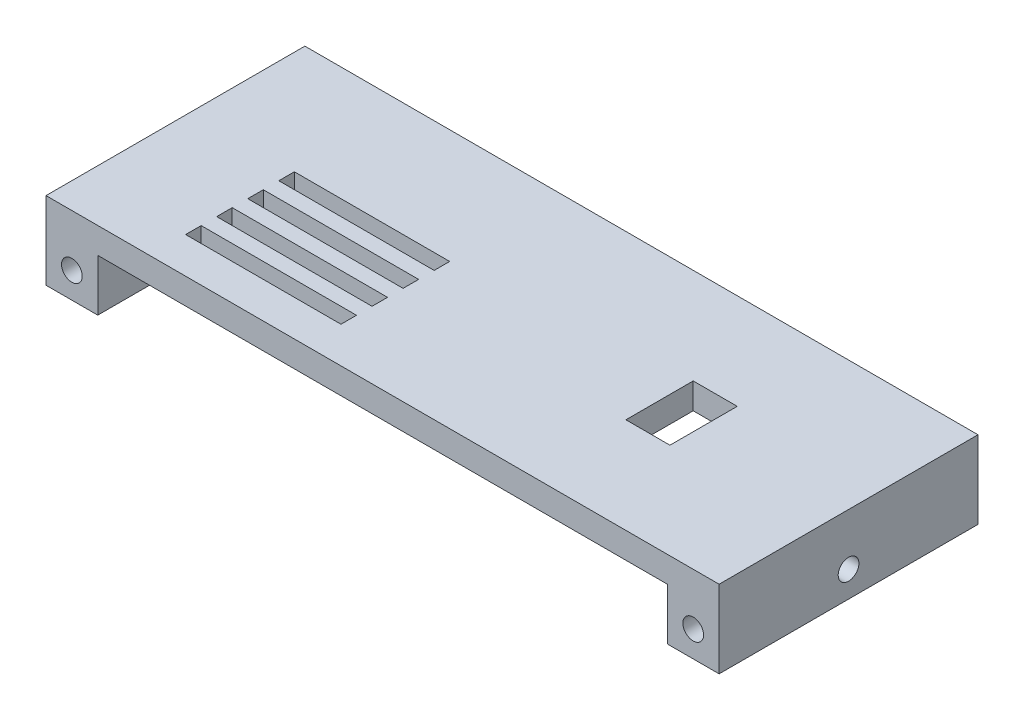
ISO-10303-21;
HEADER;
FILE_DESCRIPTION(('STEP AP214'),'2;1');
FILE_NAME('part.step','',(''),(''),'','','');
FILE_SCHEMA(('AUTOMOTIVE_DESIGN { 1 0 10303 214 1 1 1 1 }'));
ENDSEC;
DATA;
#1=APPLICATION_CONTEXT('core data for automotive mechanical design processes');
#2=APPLICATION_PROTOCOL_DEFINITION('international standard','automotive_design',2000,#1);
#3=PRODUCT_CONTEXT('',#1,'mechanical');
#4=PRODUCT('Part','Part','',(#3));
#5=PRODUCT_RELATED_PRODUCT_CATEGORY('part','',(#4));
#6=PRODUCT_DEFINITION_FORMATION('','',#4);
#7=PRODUCT_DEFINITION_CONTEXT('part definition',#1,'design');
#8=PRODUCT_DEFINITION('design','',#6,#7);
#9=PRODUCT_DEFINITION_SHAPE('','',#8);
#10=(LENGTH_UNIT() NAMED_UNIT(*) SI_UNIT(.MILLI.,.METRE.));
#11=(NAMED_UNIT(*) PLANE_ANGLE_UNIT() SI_UNIT($,.RADIAN.));
#12=(NAMED_UNIT(*) SI_UNIT($,.STERADIAN.) SOLID_ANGLE_UNIT());
#13=UNCERTAINTY_MEASURE_WITH_UNIT(LENGTH_MEASURE(1.E-05),#10,'distance_accuracy_value','');
#14=(GEOMETRIC_REPRESENTATION_CONTEXT(3) GLOBAL_UNCERTAINTY_ASSIGNED_CONTEXT((#13)) GLOBAL_UNIT_ASSIGNED_CONTEXT((#10,
#11,#12)) REPRESENTATION_CONTEXT('',''));
#15=CARTESIAN_POINT('',(0.,0.,0.));
#16=DIRECTION('',(0.,0.,1.));
#17=DIRECTION('',(1.,0.,0.));
#18=AXIS2_PLACEMENT_3D('',#15,#16,#17);
#19=CARTESIAN_POINT('',(0.,0.,0.));
#20=DIRECTION('',(0.,1.,0.));
#21=DIRECTION('',(0.,0.,1.));
#22=AXIS2_PLACEMENT_3D('',#19,#20,#21);
#23=PLANE('',#22);
#24=DIRECTION('',(-1.,0.,0.));
#25=VECTOR('',#24,1.);
#26=CARTESIAN_POINT('',(-130.,0.,-50.));
#27=LINE('',#26,#25);
#28=CARTESIAN_POINT('',(-120.,0.,-50.));
#29=VERTEX_POINT('',#28);
#30=CARTESIAN_POINT('',(-130.,0.,-50.));
#31=VERTEX_POINT('',#30);
#32=EDGE_CURVE('E480',#29,#31,#27,.T.);
#33=ORIENTED_EDGE('',*,*,#32,.F.);
#34=DIRECTION('',(0.,0.,1.));
#35=VECTOR('',#34,1.);
#36=CARTESIAN_POINT('',(-120.,0.,0.));
#37=LINE('',#36,#35);
#38=CARTESIAN_POINT('',(-120.,0.,0.));
#39=VERTEX_POINT('',#38);
#40=EDGE_CURVE('E503',#29,#39,#37,.T.);
#41=ORIENTED_EDGE('',*,*,#40,.T.);
#42=DIRECTION('',(1.,0.,0.));
#43=VECTOR('',#42,1.);
#44=CARTESIAN_POINT('',(-130.,0.,0.));
#45=LINE('',#44,#43);
#46=CARTESIAN_POINT('',(-130.,0.,0.));
#47=VERTEX_POINT('',#46);
#48=EDGE_CURVE('E473',#47,#39,#45,.T.);
#49=ORIENTED_EDGE('',*,*,#48,.F.);
#50=DIRECTION('',(0.,0.,1.));
#51=VECTOR('',#50,1.);
#52=CARTESIAN_POINT('',(-130.,0.,-50.));
#53=LINE('',#52,#51);
#54=EDGE_CURVE('E453',#31,#47,#53,.T.);
#55=ORIENTED_EDGE('',*,*,#54,.F.);
#56=EDGE_LOOP('',(#33,#41,#49,#55));
#57=FACE_BOUND('',#56,.T.);
#58=ADVANCED_FACE('F40',(#57),#23,.F.);
#59=CARTESIAN_POINT('',(-130.,15.,-50.));
#60=DIRECTION('',(1.,0.,0.));
#61=DIRECTION('',(0.,0.,-1.));
#62=AXIS2_PLACEMENT_3D('',#59,#60,#61);
#63=PLANE('',#62);
#64=CARTESIAN_POINT('',(-130.,5.,-25.));
#65=DIRECTION('',(-1.,0.,0.));
#66=DIRECTION('',(0.,0.,1.));
#67=AXIS2_PLACEMENT_3D('',#64,#65,#66);
#68=CIRCLE('',#67,2.);
#69=CARTESIAN_POINT('',(-130.,5.,-23.));
#70=VERTEX_POINT('',#69);
#71=EDGE_CURVE('E397',#70,#70,#68,.T.);
#72=ORIENTED_EDGE('',*,*,#71,.F.);
#73=EDGE_LOOP('',(#72));
#74=FACE_BOUND('',#73,.T.);
#75=ORIENTED_EDGE('',*,*,#54,.T.);
#76=DIRECTION('',(0.,-1.,0.));
#77=VECTOR('',#76,1.);
#78=CARTESIAN_POINT('',(-130.,15.,0.));
#79=LINE('',#78,#77);
#80=CARTESIAN_POINT('',(-130.,15.,0.));
#81=VERTEX_POINT('',#80);
#82=EDGE_CURVE('E495',#81,#47,#79,.T.);
#83=ORIENTED_EDGE('',*,*,#82,.F.);
#84=DIRECTION('',(0.,0.,1.));
#85=VECTOR('',#84,1.);
#86=CARTESIAN_POINT('',(-130.,15.,-50.));
#87=LINE('',#86,#85);
#88=CARTESIAN_POINT('',(-130.,15.,-50.));
#89=VERTEX_POINT('',#88);
#90=EDGE_CURVE('E454',#89,#81,#87,.T.);
#91=ORIENTED_EDGE('',*,*,#90,.F.);
#92=DIRECTION('',(0.,-1.,0.));
#93=VECTOR('',#92,1.);
#94=CARTESIAN_POINT('',(-130.,15.,-50.));
#95=LINE('',#94,#93);
#96=EDGE_CURVE('E468',#89,#31,#95,.T.);
#97=ORIENTED_EDGE('',*,*,#96,.T.);
#98=EDGE_LOOP('',(#75,#83,#91,#97));
#99=FACE_BOUND('',#98,.T.);
#100=ADVANCED_FACE('F42',(#74,#99),#63,.F.);
#101=CARTESIAN_POINT('',(-130.,15.,0.));
#102=DIRECTION('',(0.,0.,-1.));
#103=DIRECTION('',(-1.,0.,0.));
#104=AXIS2_PLACEMENT_3D('',#101,#102,#103);
#105=PLANE('',#104);
#106=CARTESIAN_POINT('',(-5.,5.,0.));
#107=DIRECTION('',(0.,0.,1.));
#108=DIRECTION('',(1.,0.,0.));
#109=AXIS2_PLACEMENT_3D('',#106,#107,#108);
#110=CIRCLE('',#109,2.);
#111=CARTESIAN_POINT('',(-3.,5.,0.));
#112=VERTEX_POINT('',#111);
#113=EDGE_CURVE('E398',#112,#112,#110,.T.);
#114=ORIENTED_EDGE('',*,*,#113,.F.);
#115=EDGE_LOOP('',(#114));
#116=FACE_BOUND('',#115,.T.);
#117=CARTESIAN_POINT('',(-125.,5.,0.));
#118=DIRECTION('',(0.,0.,1.));
#119=DIRECTION('',(1.,0.,0.));
#120=AXIS2_PLACEMENT_3D('',#117,#118,#119);
#121=CIRCLE('',#120,2.);
#122=CARTESIAN_POINT('',(-123.,5.,0.));
#123=VERTEX_POINT('',#122);
#124=EDGE_CURVE('E381',#123,#123,#121,.T.);
#125=ORIENTED_EDGE('',*,*,#124,.F.);
#126=EDGE_LOOP('',(#125));
#127=FACE_BOUND('',#126,.T.);
#128=ORIENTED_EDGE('',*,*,#48,.T.);
#129=DIRECTION('',(0.,1.,0.));
#130=VECTOR('',#129,1.);
#131=CARTESIAN_POINT('',(-120.,15.,0.));
#132=LINE('',#131,#130);
#133=CARTESIAN_POINT('',(-120.,10.,0.));
#134=VERTEX_POINT('',#133);
#135=EDGE_CURVE('E445',#39,#134,#132,.T.);
#136=ORIENTED_EDGE('',*,*,#135,.T.);
#137=DIRECTION('',(1.,0.,0.));
#138=VECTOR('',#137,1.);
#139=CARTESIAN_POINT('',(-130.,10.,0.));
#140=LINE('',#139,#138);
#141=CARTESIAN_POINT('',(-10.,10.,0.));
#142=VERTEX_POINT('',#141);
#143=EDGE_CURVE('E449',#134,#142,#140,.T.);
#144=ORIENTED_EDGE('',*,*,#143,.T.);
#145=DIRECTION('',(0.,-1.,0.));
#146=VECTOR('',#145,1.);
#147=CARTESIAN_POINT('',(-9.99999999999999,15.,0.));
#148=LINE('',#147,#146);
#149=CARTESIAN_POINT('',(-10.,0.,0.));
#150=VERTEX_POINT('',#149);
#151=EDGE_CURVE('E439',#142,#150,#148,.T.);
#152=ORIENTED_EDGE('',*,*,#151,.T.);
#153=CARTESIAN_POINT('',(0.,0.,0.));
#154=VERTEX_POINT('',#153);
#155=EDGE_CURVE('E472',#150,#154,#45,.T.);
#156=ORIENTED_EDGE('',*,*,#155,.T.);
#157=DIRECTION('',(0.,-1.,0.));
#158=VECTOR('',#157,1.);
#159=CARTESIAN_POINT('',(0.,15.,0.));
#160=LINE('',#159,#158);
#161=CARTESIAN_POINT('',(0.,15.,0.));
#162=VERTEX_POINT('',#161);
#163=EDGE_CURVE('E491',#162,#154,#160,.T.);
#164=ORIENTED_EDGE('',*,*,#163,.F.);
#165=DIRECTION('',(1.,0.,0.));
#166=VECTOR('',#165,1.);
#167=CARTESIAN_POINT('',(-130.,15.,0.));
#168=LINE('',#167,#166);
#169=EDGE_CURVE('E458',#81,#162,#168,.T.);
#170=ORIENTED_EDGE('',*,*,#169,.F.);
#171=ORIENTED_EDGE('',*,*,#82,.T.);
#172=EDGE_LOOP('',(#128,#136,#144,#152,#156,#164,#170,#171));
#173=FACE_BOUND('',#172,.T.);
#174=ADVANCED_FACE('F604',(#116,#127,#173),#105,.F.);
#175=CARTESIAN_POINT('',(0.,15.,-50.));
#176=DIRECTION('',(-1.,0.,0.));
#177=DIRECTION('',(0.,0.,1.));
#178=AXIS2_PLACEMENT_3D('',#175,#176,#177);
#179=PLANE('',#178);
#180=CARTESIAN_POINT('',(0.,5.,-25.));
#181=DIRECTION('',(1.,0.,0.));
#182=DIRECTION('',(0.,0.,-1.));
#183=AXIS2_PLACEMENT_3D('',#180,#181,#182);
#184=CIRCLE('',#183,2.);
#185=CARTESIAN_POINT('',(0.,5.,-27.));
#186=VERTEX_POINT('',#185);
#187=EDGE_CURVE('E413',#186,#186,#184,.T.);
#188=ORIENTED_EDGE('',*,*,#187,.F.);
#189=EDGE_LOOP('',(#188));
#190=FACE_BOUND('',#189,.T.);
#191=DIRECTION('',(0.,0.,-1.));
#192=VECTOR('',#191,1.);
#193=CARTESIAN_POINT('',(0.,0.,-50.));
#194=LINE('',#193,#192);
#195=CARTESIAN_POINT('',(0.,0.,-50.));
#196=VERTEX_POINT('',#195);
#197=EDGE_CURVE('E477',#154,#196,#194,.T.);
#198=ORIENTED_EDGE('',*,*,#197,.T.);
#199=DIRECTION('',(0.,-1.,0.));
#200=VECTOR('',#199,1.);
#201=CARTESIAN_POINT('',(0.,15.,-50.));
#202=LINE('',#201,#200);
#203=CARTESIAN_POINT('',(0.,15.,-50.));
#204=VERTEX_POINT('',#203);
#205=EDGE_CURVE('E487',#204,#196,#202,.T.);
#206=ORIENTED_EDGE('',*,*,#205,.F.);
#207=DIRECTION('',(0.,0.,-1.));
#208=VECTOR('',#207,1.);
#209=CARTESIAN_POINT('',(0.,15.,-50.));
#210=LINE('',#209,#208);
#211=EDGE_CURVE('E462',#162,#204,#210,.T.);
#212=ORIENTED_EDGE('',*,*,#211,.F.);
#213=ORIENTED_EDGE('',*,*,#163,.T.);
#214=EDGE_LOOP('',(#198,#206,#212,#213));
#215=FACE_BOUND('',#214,.T.);
#216=ADVANCED_FACE('F641',(#190,#215),#179,.F.);
#217=CARTESIAN_POINT('',(-130.,15.,-50.));
#218=DIRECTION('',(0.,0.,1.));
#219=DIRECTION('',(1.,0.,0.));
#220=AXIS2_PLACEMENT_3D('',#217,#218,#219);
#221=PLANE('',#220);
#222=CARTESIAN_POINT('',(-125.,5.,-50.));
#223=DIRECTION('',(0.,0.,-1.));
#224=DIRECTION('',(-1.,0.,0.));
#225=AXIS2_PLACEMENT_3D('',#222,#223,#224);
#226=CIRCLE('',#225,2.);
#227=CARTESIAN_POINT('',(-127.,5.,-50.));
#228=VERTEX_POINT('',#227);
#229=EDGE_CURVE('E382',#228,#228,#226,.T.);
#230=ORIENTED_EDGE('',*,*,#229,.F.);
#231=EDGE_LOOP('',(#230));
#232=FACE_BOUND('',#231,.T.);
#233=CARTESIAN_POINT('',(-5.,5.,-50.));
#234=DIRECTION('',(0.,0.,-1.));
#235=DIRECTION('',(-1.,0.,0.));
#236=AXIS2_PLACEMENT_3D('',#233,#234,#235);
#237=CIRCLE('',#236,2.);
#238=CARTESIAN_POINT('',(-7.,5.,-50.));
#239=VERTEX_POINT('',#238);
#240=EDGE_CURVE('E386',#239,#239,#237,.T.);
#241=ORIENTED_EDGE('',*,*,#240,.F.);
#242=EDGE_LOOP('',(#241));
#243=FACE_BOUND('',#242,.T.);
#244=DIRECTION('',(1.,0.,0.));
#245=VECTOR('',#244,1.);
#246=CARTESIAN_POINT('',(-10.,10.,-50.));
#247=LINE('',#246,#245);
#248=CARTESIAN_POINT('',(-120.,10.,-50.));
#249=VERTEX_POINT('',#248);
#250=CARTESIAN_POINT('',(-10.,10.,-50.));
#251=VERTEX_POINT('',#250);
#252=EDGE_CURVE('E428',#249,#251,#247,.T.);
#253=ORIENTED_EDGE('',*,*,#252,.F.);
#254=DIRECTION('',(0.,1.,0.));
#255=VECTOR('',#254,1.);
#256=CARTESIAN_POINT('',(-120.,0.,-50.));
#257=LINE('',#256,#255);
#258=EDGE_CURVE('E421',#29,#249,#257,.T.);
#259=ORIENTED_EDGE('',*,*,#258,.F.);
#260=ORIENTED_EDGE('',*,*,#32,.T.);
#261=ORIENTED_EDGE('',*,*,#96,.F.);
#262=DIRECTION('',(-1.,0.,0.));
#263=VECTOR('',#262,1.);
#264=CARTESIAN_POINT('',(-130.,15.,-50.));
#265=LINE('',#264,#263);
#266=EDGE_CURVE('E465',#204,#89,#265,.T.);
#267=ORIENTED_EDGE('',*,*,#266,.F.);
#268=ORIENTED_EDGE('',*,*,#205,.T.);
#269=CARTESIAN_POINT('',(-9.99999999999999,0.,-50.));
#270=VERTEX_POINT('',#269);
#271=EDGE_CURVE('E459',#196,#270,#27,.T.);
#272=ORIENTED_EDGE('',*,*,#271,.T.);
#273=DIRECTION('',(0.,-1.,0.));
#274=VECTOR('',#273,1.);
#275=CARTESIAN_POINT('',(-10.,0.,-50.));
#276=LINE('',#275,#274);
#277=EDGE_CURVE('E432',#251,#270,#276,.T.);
#278=ORIENTED_EDGE('',*,*,#277,.F.);
#279=EDGE_LOOP('',(#253,#259,#260,#261,#267,#268,#272,#278));
#280=FACE_BOUND('',#279,.T.);
#281=ADVANCED_FACE('F619',(#232,#243,#280),#221,.F.);
#282=CARTESIAN_POINT('',(0.,15.,0.));
#283=DIRECTION('',(0.,1.,0.));
#284=DIRECTION('',(0.,0.,1.));
#285=AXIS2_PLACEMENT_3D('',#282,#283,#284);
#286=PLANE('',#285);
#287=DIRECTION('',(0.,0.,1.));
#288=VECTOR('',#287,1.);
#289=CARTESIAN_POINT('',(-110.,15.,-9.96651766720639));
#290=LINE('',#289,#288);
#291=CARTESIAN_POINT('',(-110.,15.,-9.96651766720639));
#292=VERTEX_POINT('',#291);
#293=CARTESIAN_POINT('',(-110.,15.,-6.96651766720639));
#294=VERTEX_POINT('',#293);
#295=EDGE_CURVE('E56',#292,#294,#290,.T.);
#296=ORIENTED_EDGE('',*,*,#295,.F.);
#297=DIRECTION('',(-1.,0.,0.));
#298=VECTOR('',#297,1.);
#299=CARTESIAN_POINT('',(-110.,15.,-9.96651766720639));
#300=LINE('',#299,#298);
#301=CARTESIAN_POINT('',(-79.9999999999999,15.,-9.96651766720639));
#302=VERTEX_POINT('',#301);
#303=EDGE_CURVE('E252',#302,#292,#300,.T.);
#304=ORIENTED_EDGE('',*,*,#303,.F.);
#305=DIRECTION('',(0.,0.,-1.));
#306=VECTOR('',#305,1.);
#307=CARTESIAN_POINT('',(-79.9999999999999,15.,-9.96651766720639));
#308=LINE('',#307,#306);
#309=CARTESIAN_POINT('',(-79.9999999999999,15.,-6.96651766720639));
#310=VERTEX_POINT('',#309);
#311=EDGE_CURVE('E233',#310,#302,#308,.T.);
#312=ORIENTED_EDGE('',*,*,#311,.F.);
#313=DIRECTION('',(1.,0.,0.));
#314=VECTOR('',#313,1.);
#315=CARTESIAN_POINT('',(-110.,15.,-6.96651766720639));
#316=LINE('',#315,#314);
#317=EDGE_CURVE('E244',#294,#310,#316,.T.);
#318=ORIENTED_EDGE('',*,*,#317,.F.);
#319=EDGE_LOOP('',(#296,#304,#312,#318));
#320=FACE_BOUND('',#319,.T.);
#321=DIRECTION('',(0.,0.,1.));
#322=VECTOR('',#321,1.);
#323=CARTESIAN_POINT('',(-110.,15.,-12.9665176672064));
#324=LINE('',#323,#322);
#325=CARTESIAN_POINT('',(-110.,15.,-15.9665176672064));
#326=VERTEX_POINT('',#325);
#327=CARTESIAN_POINT('',(-110.,15.,-12.9665176672064));
#328=VERTEX_POINT('',#327);
#329=EDGE_CURVE('E64',#326,#328,#324,.T.);
#330=ORIENTED_EDGE('',*,*,#329,.F.);
#331=DIRECTION('',(-1.,0.,0.));
#332=VECTOR('',#331,1.);
#333=CARTESIAN_POINT('',(-79.9999999999999,15.,-15.9665176672064));
#334=LINE('',#333,#332);
#335=CARTESIAN_POINT('',(-79.9999999999999,15.,-15.9665176672064));
#336=VERTEX_POINT('',#335);
#337=EDGE_CURVE('E278',#336,#326,#334,.T.);
#338=ORIENTED_EDGE('',*,*,#337,.F.);
#339=DIRECTION('',(0.,0.,-1.));
#340=VECTOR('',#339,1.);
#341=CARTESIAN_POINT('',(-79.9999999999999,15.,-12.9665176672064));
#342=LINE('',#341,#340);
#343=CARTESIAN_POINT('',(-79.9999999999999,15.,-12.9665176672064));
#344=VERTEX_POINT('',#343);
#345=EDGE_CURVE('E274',#344,#336,#342,.T.);
#346=ORIENTED_EDGE('',*,*,#345,.F.);
#347=DIRECTION('',(1.,0.,0.));
#348=VECTOR('',#347,1.);
#349=CARTESIAN_POINT('',(-79.9999999999999,15.,-12.9665176672064));
#350=LINE('',#349,#348);
#351=EDGE_CURVE('E269',#328,#344,#350,.T.);
#352=ORIENTED_EDGE('',*,*,#351,.F.);
#353=EDGE_LOOP('',(#330,#338,#346,#352));
#354=FACE_BOUND('',#353,.T.);
#355=DIRECTION('',(0.,0.,-1.));
#356=VECTOR('',#355,1.);
#357=CARTESIAN_POINT('',(-79.9999999999999,15.,-18.9665176672064));
#358=LINE('',#357,#356);
#359=CARTESIAN_POINT('',(-79.9999999999999,15.,-18.9665176672064));
#360=VERTEX_POINT('',#359);
#361=CARTESIAN_POINT('',(-79.9999999999999,15.,-21.9665176672064));
#362=VERTEX_POINT('',#361);
#363=EDGE_CURVE('E294',#360,#362,#358,.T.);
#364=ORIENTED_EDGE('',*,*,#363,.F.);
#365=DIRECTION('',(1.,0.,0.));
#366=VECTOR('',#365,1.);
#367=CARTESIAN_POINT('',(-110.,15.,-18.9665176672064));
#368=LINE('',#367,#366);
#369=CARTESIAN_POINT('',(-110.,15.,-18.9665176672064));
#370=VERTEX_POINT('',#369);
#371=EDGE_CURVE('E306',#370,#360,#368,.T.);
#372=ORIENTED_EDGE('',*,*,#371,.F.);
#373=DIRECTION('',(0.,0.,1.));
#374=VECTOR('',#373,1.);
#375=CARTESIAN_POINT('',(-110.,15.,-18.9665176672064));
#376=LINE('',#375,#374);
#377=CARTESIAN_POINT('',(-110.,15.,-21.9665176672064));
#378=VERTEX_POINT('',#377);
#379=EDGE_CURVE('E302',#378,#370,#376,.T.);
#380=ORIENTED_EDGE('',*,*,#379,.F.);
#381=DIRECTION('',(-1.,0.,0.));
#382=VECTOR('',#381,1.);
#383=CARTESIAN_POINT('',(-110.,15.,-21.9665176672064));
#384=LINE('',#383,#382);
#385=EDGE_CURVE('E297',#362,#378,#384,.T.);
#386=ORIENTED_EDGE('',*,*,#385,.F.);
#387=EDGE_LOOP('',(#364,#372,#380,#386));
#388=FACE_BOUND('',#387,.T.);
#389=DIRECTION('',(0.,0.,-1.));
#390=VECTOR('',#389,1.);
#391=CARTESIAN_POINT('',(-79.9999999999999,15.,-24.9665176672064));
#392=LINE('',#391,#390);
#393=CARTESIAN_POINT('',(-79.9999999999999,15.,-24.9665176672064));
#394=VERTEX_POINT('',#393);
#395=CARTESIAN_POINT('',(-79.9999999999999,15.,-27.9665176672064));
#396=VERTEX_POINT('',#395);
#397=EDGE_CURVE('E322',#394,#396,#392,.T.);
#398=ORIENTED_EDGE('',*,*,#397,.F.);
#399=DIRECTION('',(1.,0.,0.));
#400=VECTOR('',#399,1.);
#401=CARTESIAN_POINT('',(-110.,15.,-24.9665176672064));
#402=LINE('',#401,#400);
#403=CARTESIAN_POINT('',(-110.,15.,-24.9665176672064));
#404=VERTEX_POINT('',#403);
#405=EDGE_CURVE('E333',#404,#394,#402,.T.);
#406=ORIENTED_EDGE('',*,*,#405,.F.);
#407=DIRECTION('',(0.,0.,1.));
#408=VECTOR('',#407,1.);
#409=CARTESIAN_POINT('',(-110.,15.,-24.9665176672064));
#410=LINE('',#409,#408);
#411=CARTESIAN_POINT('',(-110.,15.,-27.9665176672064));
#412=VERTEX_POINT('',#411);
#413=EDGE_CURVE('E329',#412,#404,#410,.T.);
#414=ORIENTED_EDGE('',*,*,#413,.F.);
#415=DIRECTION('',(-1.,0.,0.));
#416=VECTOR('',#415,1.);
#417=CARTESIAN_POINT('',(-110.,15.,-27.9665176672064));
#418=LINE('',#417,#416);
#419=EDGE_CURVE('E325',#396,#412,#418,.T.);
#420=ORIENTED_EDGE('',*,*,#419,.F.);
#421=EDGE_LOOP('',(#398,#406,#414,#420));
#422=FACE_BOUND('',#421,.T.);
#423=DIRECTION('',(0.,0.,1.));
#424=VECTOR('',#423,1.);
#425=CARTESIAN_POINT('',(-36.5,15.,-31.5));
#426=LINE('',#425,#424);
#427=CARTESIAN_POINT('',(-36.5,15.,-31.5));
#428=VERTEX_POINT('',#427);
#429=CARTESIAN_POINT('',(-36.5,15.,-18.5));
#430=VERTEX_POINT('',#429);
#431=EDGE_CURVE('E262',#428,#430,#426,.T.);
#432=ORIENTED_EDGE('',*,*,#431,.F.);
#433=DIRECTION('',(-1.,0.,0.));
#434=VECTOR('',#433,1.);
#435=CARTESIAN_POINT('',(-36.5,15.,-31.5));
#436=LINE('',#435,#434);
#437=CARTESIAN_POINT('',(-28.,15.,-31.5));
#438=VERTEX_POINT('',#437);
#439=EDGE_CURVE('E359',#438,#428,#436,.T.);
#440=ORIENTED_EDGE('',*,*,#439,.F.);
#441=DIRECTION('',(0.,0.,-1.));
#442=VECTOR('',#441,1.);
#443=CARTESIAN_POINT('',(-28.,15.,-31.5));
#444=LINE('',#443,#442);
#445=CARTESIAN_POINT('',(-28.,15.,-18.5));
#446=VERTEX_POINT('',#445);
#447=EDGE_CURVE('E355',#446,#438,#444,.T.);
#448=ORIENTED_EDGE('',*,*,#447,.F.);
#449=DIRECTION('',(1.,0.,0.));
#450=VECTOR('',#449,1.);
#451=CARTESIAN_POINT('',(-36.5,15.,-18.5));
#452=LINE('',#451,#450);
#453=EDGE_CURVE('E351',#430,#446,#452,.T.);
#454=ORIENTED_EDGE('',*,*,#453,.F.);
#455=EDGE_LOOP('',(#432,#440,#448,#454));
#456=FACE_BOUND('',#455,.T.);
#457=ORIENTED_EDGE('',*,*,#90,.T.);
#458=ORIENTED_EDGE('',*,*,#169,.T.);
#459=ORIENTED_EDGE('',*,*,#211,.T.);
#460=ORIENTED_EDGE('',*,*,#266,.T.);
#461=EDGE_LOOP('',(#457,#458,#459,#460));
#462=FACE_BOUND('',#461,.T.);
#463=ADVANCED_FACE('F249',(#320,#354,#388,#422,#456,#462),#286,.T.);
#464=ORIENTED_EDGE('',*,*,#155,.F.);
#465=DIRECTION('',(0.,0.,-1.));
#466=VECTOR('',#465,1.);
#467=CARTESIAN_POINT('',(-10.,0.,0.));
#468=LINE('',#467,#466);
#469=EDGE_CURVE('E499',#150,#270,#468,.T.);
#470=ORIENTED_EDGE('',*,*,#469,.T.);
#471=ORIENTED_EDGE('',*,*,#271,.F.);
#472=ORIENTED_EDGE('',*,*,#197,.F.);
#473=EDGE_LOOP('',(#464,#470,#471,#472));
#474=FACE_BOUND('',#473,.T.);
#475=ADVANCED_FACE('F600',(#474),#23,.F.);
#476=CARTESIAN_POINT('',(-10.,10.,1.));
#477=DIRECTION('',(0.,1.,0.));
#478=DIRECTION('',(0.,0.,1.));
#479=AXIS2_PLACEMENT_3D('',#476,#477,#478);
#480=PLANE('',#479);
#481=DIRECTION('',(-1.,0.,0.));
#482=VECTOR('',#481,1.);
#483=CARTESIAN_POINT('',(-10.,10.,-9.96651766720639));
#484=LINE('',#483,#482);
#485=CARTESIAN_POINT('',(-79.9999999999999,10.,-9.96651766720639));
#486=VERTEX_POINT('',#485);
#487=CARTESIAN_POINT('',(-110.,10.,-9.96651766720639));
#488=VERTEX_POINT('',#487);
#489=EDGE_CURVE('E49',#486,#488,#484,.T.);
#490=ORIENTED_EDGE('',*,*,#489,.T.);
#491=DIRECTION('',(0.,0.,1.));
#492=VECTOR('',#491,1.);
#493=CARTESIAN_POINT('',(-110.,10.,1.));
#494=LINE('',#493,#492);
#495=CARTESIAN_POINT('',(-110.,10.,-6.96651766720639));
#496=VERTEX_POINT('',#495);
#497=EDGE_CURVE('E11',#488,#496,#494,.T.);
#498=ORIENTED_EDGE('',*,*,#497,.T.);
#499=DIRECTION('',(1.,0.,0.));
#500=VECTOR('',#499,1.);
#501=CARTESIAN_POINT('',(-10.,10.,-6.96651766720639));
#502=LINE('',#501,#500);
#503=CARTESIAN_POINT('',(-79.9999999999999,10.,-6.96651766720639));
#504=VERTEX_POINT('',#503);
#505=EDGE_CURVE('E571',#496,#504,#502,.T.);
#506=ORIENTED_EDGE('',*,*,#505,.T.);
#507=DIRECTION('',(0.,0.,-1.));
#508=VECTOR('',#507,1.);
#509=CARTESIAN_POINT('',(-79.9999999999999,10.,1.));
#510=LINE('',#509,#508);
#511=EDGE_CURVE('E236',#504,#486,#510,.T.);
#512=ORIENTED_EDGE('',*,*,#511,.T.);
#513=EDGE_LOOP('',(#490,#498,#506,#512));
#514=FACE_BOUND('',#513,.T.);
#515=DIRECTION('',(-1.,0.,0.));
#516=VECTOR('',#515,1.);
#517=CARTESIAN_POINT('',(-10.,10.,-15.9665176672064));
#518=LINE('',#517,#516);
#519=CARTESIAN_POINT('',(-79.9999999999999,10.,-15.9665176672064));
#520=VERTEX_POINT('',#519);
#521=CARTESIAN_POINT('',(-110.,10.,-15.9665176672064));
#522=VERTEX_POINT('',#521);
#523=EDGE_CURVE('E563',#520,#522,#518,.T.);
#524=ORIENTED_EDGE('',*,*,#523,.T.);
#525=DIRECTION('',(0.,0.,1.));
#526=VECTOR('',#525,1.);
#527=CARTESIAN_POINT('',(-110.,10.,1.));
#528=LINE('',#527,#526);
#529=CARTESIAN_POINT('',(-110.,10.,-12.9665176672064));
#530=VERTEX_POINT('',#529);
#531=EDGE_CURVE('E567',#522,#530,#528,.T.);
#532=ORIENTED_EDGE('',*,*,#531,.T.);
#533=DIRECTION('',(1.,0.,0.));
#534=VECTOR('',#533,1.);
#535=CARTESIAN_POINT('',(-10.,10.,-12.9665176672064));
#536=LINE('',#535,#534);
#537=CARTESIAN_POINT('',(-79.9999999999999,10.,-12.9665176672064));
#538=VERTEX_POINT('',#537);
#539=EDGE_CURVE('E555',#530,#538,#536,.T.);
#540=ORIENTED_EDGE('',*,*,#539,.T.);
#541=DIRECTION('',(0.,0.,-1.));
#542=VECTOR('',#541,1.);
#543=CARTESIAN_POINT('',(-79.9999999999999,10.,1.));
#544=LINE('',#543,#542);
#545=EDGE_CURVE('E559',#538,#520,#544,.T.);
#546=ORIENTED_EDGE('',*,*,#545,.T.);
#547=EDGE_LOOP('',(#524,#532,#540,#546));
#548=FACE_BOUND('',#547,.T.);
#549=DIRECTION('',(1.,0.,0.));
#550=VECTOR('',#549,1.);
#551=CARTESIAN_POINT('',(-10.,10.,-18.9665176672064));
#552=LINE('',#551,#550);
#553=CARTESIAN_POINT('',(-110.,10.,-18.9665176672064));
#554=VERTEX_POINT('',#553);
#555=CARTESIAN_POINT('',(-79.9999999999999,10.,-18.9665176672064));
#556=VERTEX_POINT('',#555);
#557=EDGE_CURVE('E547',#554,#556,#552,.T.);
#558=ORIENTED_EDGE('',*,*,#557,.T.);
#559=DIRECTION('',(0.,0.,-1.));
#560=VECTOR('',#559,1.);
#561=CARTESIAN_POINT('',(-79.9999999999999,10.,1.));
#562=LINE('',#561,#560);
#563=CARTESIAN_POINT('',(-79.9999999999999,10.,-21.9665176672064));
#564=VERTEX_POINT('',#563);
#565=EDGE_CURVE('E551',#556,#564,#562,.T.);
#566=ORIENTED_EDGE('',*,*,#565,.T.);
#567=DIRECTION('',(-1.,0.,0.));
#568=VECTOR('',#567,1.);
#569=CARTESIAN_POINT('',(-10.,10.,-21.9665176672064));
#570=LINE('',#569,#568);
#571=CARTESIAN_POINT('',(-110.,10.,-21.9665176672064));
#572=VERTEX_POINT('',#571);
#573=EDGE_CURVE('E539',#564,#572,#570,.T.);
#574=ORIENTED_EDGE('',*,*,#573,.T.);
#575=DIRECTION('',(0.,0.,1.));
#576=VECTOR('',#575,1.);
#577=CARTESIAN_POINT('',(-110.,10.,1.));
#578=LINE('',#577,#576);
#579=EDGE_CURVE('E543',#572,#554,#578,.T.);
#580=ORIENTED_EDGE('',*,*,#579,.T.);
#581=EDGE_LOOP('',(#558,#566,#574,#580));
#582=FACE_BOUND('',#581,.T.);
#583=DIRECTION('',(1.,0.,0.));
#584=VECTOR('',#583,1.);
#585=CARTESIAN_POINT('',(-10.,10.,-24.9665176672064));
#586=LINE('',#585,#584);
#587=CARTESIAN_POINT('',(-110.,10.,-24.9665176672064));
#588=VERTEX_POINT('',#587);
#589=CARTESIAN_POINT('',(-79.9999999999999,10.,-24.9665176672064));
#590=VERTEX_POINT('',#589);
#591=EDGE_CURVE('E531',#588,#590,#586,.T.);
#592=ORIENTED_EDGE('',*,*,#591,.T.);
#593=DIRECTION('',(0.,0.,-1.));
#594=VECTOR('',#593,1.);
#595=CARTESIAN_POINT('',(-79.9999999999999,10.,1.));
#596=LINE('',#595,#594);
#597=CARTESIAN_POINT('',(-79.9999999999999,10.,-27.9665176672064));
#598=VERTEX_POINT('',#597);
#599=EDGE_CURVE('E535',#590,#598,#596,.T.);
#600=ORIENTED_EDGE('',*,*,#599,.T.);
#601=DIRECTION('',(-1.,0.,0.));
#602=VECTOR('',#601,1.);
#603=CARTESIAN_POINT('',(-10.,10.,-27.9665176672064));
#604=LINE('',#603,#602);
#605=CARTESIAN_POINT('',(-110.,10.,-27.9665176672064));
#606=VERTEX_POINT('',#605);
#607=EDGE_CURVE('E523',#598,#606,#604,.T.);
#608=ORIENTED_EDGE('',*,*,#607,.T.);
#609=DIRECTION('',(0.,0.,1.));
#610=VECTOR('',#609,1.);
#611=CARTESIAN_POINT('',(-110.,10.,1.));
#612=LINE('',#611,#610);
#613=EDGE_CURVE('E527',#606,#588,#612,.T.);
#614=ORIENTED_EDGE('',*,*,#613,.T.);
#615=EDGE_LOOP('',(#592,#600,#608,#614));
#616=FACE_BOUND('',#615,.T.);
#617=DIRECTION('',(-1.,0.,0.));
#618=VECTOR('',#617,1.);
#619=CARTESIAN_POINT('',(-10.,10.,-31.5));
#620=LINE('',#619,#618);
#621=CARTESIAN_POINT('',(-28.,10.,-31.5));
#622=VERTEX_POINT('',#621);
#623=CARTESIAN_POINT('',(-36.5,10.,-31.5));
#624=VERTEX_POINT('',#623);
#625=EDGE_CURVE('E515',#622,#624,#620,.T.);
#626=ORIENTED_EDGE('',*,*,#625,.T.);
#627=DIRECTION('',(0.,0.,1.));
#628=VECTOR('',#627,1.);
#629=CARTESIAN_POINT('',(-36.5,10.,1.));
#630=LINE('',#629,#628);
#631=CARTESIAN_POINT('',(-36.5,10.,-18.5));
#632=VERTEX_POINT('',#631);
#633=EDGE_CURVE('E519',#624,#632,#630,.T.);
#634=ORIENTED_EDGE('',*,*,#633,.T.);
#635=DIRECTION('',(1.,0.,0.));
#636=VECTOR('',#635,1.);
#637=CARTESIAN_POINT('',(-10.,10.,-18.5));
#638=LINE('',#637,#636);
#639=CARTESIAN_POINT('',(-28.,10.,-18.5));
#640=VERTEX_POINT('',#639);
#641=EDGE_CURVE('E507',#632,#640,#638,.T.);
#642=ORIENTED_EDGE('',*,*,#641,.T.);
#643=DIRECTION('',(0.,0.,-1.));
#644=VECTOR('',#643,1.);
#645=CARTESIAN_POINT('',(-28.,10.,1.));
#646=LINE('',#645,#644);
#647=EDGE_CURVE('E511',#640,#622,#646,.T.);
#648=ORIENTED_EDGE('',*,*,#647,.T.);
#649=EDGE_LOOP('',(#626,#634,#642,#648));
#650=FACE_BOUND('',#649,.T.);
#651=DIRECTION('',(0.,0.,-1.));
#652=VECTOR('',#651,1.);
#653=CARTESIAN_POINT('',(-120.,10.,1.));
#654=LINE('',#653,#652);
#655=EDGE_CURVE('E435',#134,#249,#654,.T.);
#656=ORIENTED_EDGE('',*,*,#655,.T.);
#657=ORIENTED_EDGE('',*,*,#252,.T.);
#658=DIRECTION('',(0.,0.,-1.));
#659=VECTOR('',#658,1.);
#660=CARTESIAN_POINT('',(-10.,10.,1.));
#661=LINE('',#660,#659);
#662=EDGE_CURVE('E436',#142,#251,#661,.T.);
#663=ORIENTED_EDGE('',*,*,#662,.F.);
#664=ORIENTED_EDGE('',*,*,#143,.F.);
#665=EDGE_LOOP('',(#656,#657,#663,#664));
#666=FACE_BOUND('',#665,.T.);
#667=ADVANCED_FACE('F578',(#514,#548,#582,#616,#650,#666),#480,.F.);
#668=CARTESIAN_POINT('',(-120.,0.,1.));
#669=DIRECTION('',(-1.,0.,0.));
#670=DIRECTION('',(0.,0.,1.));
#671=AXIS2_PLACEMENT_3D('',#668,#669,#670);
#672=PLANE('',#671);
#673=CARTESIAN_POINT('',(-120.,5.,-25.));
#674=DIRECTION('',(-1.,0.,0.));
#675=DIRECTION('',(0.,0.,1.));
#676=AXIS2_PLACEMENT_3D('',#673,#674,#675);
#677=CIRCLE('',#676,2.);
#678=CARTESIAN_POINT('',(-120.,5.,-23.));
#679=VERTEX_POINT('',#678);
#680=EDGE_CURVE('E409',#679,#679,#677,.T.);
#681=ORIENTED_EDGE('',*,*,#680,.T.);
#682=EDGE_LOOP('',(#681));
#683=FACE_BOUND('',#682,.T.);
#684=ORIENTED_EDGE('',*,*,#40,.F.);
#685=ORIENTED_EDGE('',*,*,#258,.T.);
#686=ORIENTED_EDGE('',*,*,#655,.F.);
#687=ORIENTED_EDGE('',*,*,#135,.F.);
#688=EDGE_LOOP('',(#684,#685,#686,#687));
#689=FACE_BOUND('',#688,.T.);
#690=ADVANCED_FACE('F616',(#683,#689),#672,.F.);
#691=CARTESIAN_POINT('',(-10.,0.,1.));
#692=DIRECTION('',(1.,0.,0.));
#693=DIRECTION('',(0.,0.,-1.));
#694=AXIS2_PLACEMENT_3D('',#691,#692,#693);
#695=PLANE('',#694);
#696=CARTESIAN_POINT('',(-10.,5.,-25.));
#697=DIRECTION('',(1.,0.,0.));
#698=DIRECTION('',(0.,0.,-1.));
#699=AXIS2_PLACEMENT_3D('',#696,#697,#698);
#700=CIRCLE('',#699,2.);
#701=CARTESIAN_POINT('',(-10.,5.,-27.));
#702=VERTEX_POINT('',#701);
#703=EDGE_CURVE('E417',#702,#702,#700,.T.);
#704=ORIENTED_EDGE('',*,*,#703,.T.);
#705=EDGE_LOOP('',(#704));
#706=FACE_BOUND('',#705,.T.);
#707=ORIENTED_EDGE('',*,*,#662,.T.);
#708=ORIENTED_EDGE('',*,*,#277,.T.);
#709=ORIENTED_EDGE('',*,*,#469,.F.);
#710=ORIENTED_EDGE('',*,*,#151,.F.);
#711=EDGE_LOOP('',(#707,#708,#709,#710));
#712=FACE_BOUND('',#711,.T.);
#713=ADVANCED_FACE('F656',(#706,#712),#695,.F.);
#714=CARTESIAN_POINT('',(-10.,5.,-25.));
#715=DIRECTION('',(1.,0.,0.));
#716=DIRECTION('',(0.,0.,-1.));
#717=AXIS2_PLACEMENT_3D('',#714,#715,#716);
#718=CYLINDRICAL_SURFACE('',#717,2.);
#719=ORIENTED_EDGE('',*,*,#703,.F.);
#720=EDGE_LOOP('',(#719));
#721=FACE_BOUND('',#720,.T.);
#722=ORIENTED_EDGE('',*,*,#187,.T.);
#723=EDGE_LOOP('',(#722));
#724=FACE_BOUND('',#723,.T.);
#725=ADVANCED_FACE('F653',(#721,#724),#718,.F.);
#726=CARTESIAN_POINT('',(-120.,5.,-25.));
#727=DIRECTION('',(-1.,0.,0.));
#728=DIRECTION('',(0.,0.,1.));
#729=AXIS2_PLACEMENT_3D('',#726,#727,#728);
#730=CYLINDRICAL_SURFACE('',#729,2.);
#731=ORIENTED_EDGE('',*,*,#680,.F.);
#732=EDGE_LOOP('',(#731));
#733=FACE_BOUND('',#732,.T.);
#734=ORIENTED_EDGE('',*,*,#71,.T.);
#735=EDGE_LOOP('',(#734));
#736=FACE_BOUND('',#735,.T.);
#737=ADVANCED_FACE('F655',(#733,#736),#730,.F.);
#738=CARTESIAN_POINT('',(-125.,5.,-10.));
#739=DIRECTION('',(0.,0.,1.));
#740=DIRECTION('',(1.,0.,0.));
#741=AXIS2_PLACEMENT_3D('',#738,#739,#740);
#742=CYLINDRICAL_SURFACE('',#741,2.);
#743=CARTESIAN_POINT('',(-125.,5.,-10.));
#744=DIRECTION('',(0.,0.,1.));
#745=DIRECTION('',(1.,0.,0.));
#746=AXIS2_PLACEMENT_3D('',#743,#744,#745);
#747=CIRCLE('',#746,2.);
#748=CARTESIAN_POINT('',(-123.,5.,-10.));
#749=VERTEX_POINT('',#748);
#750=EDGE_CURVE('E402',#749,#749,#747,.T.);
#751=ORIENTED_EDGE('',*,*,#750,.F.);
#752=EDGE_LOOP('',(#751));
#753=FACE_BOUND('',#752,.T.);
#754=ORIENTED_EDGE('',*,*,#124,.T.);
#755=EDGE_LOOP('',(#754));
#756=FACE_BOUND('',#755,.T.);
#757=ADVANCED_FACE('F663',(#753,#756),#742,.F.);
#758=CARTESIAN_POINT('',(-125.,5.,-10.));
#759=DIRECTION('',(0.,0.,1.));
#760=DIRECTION('',(1.,0.,0.));
#761=AXIS2_PLACEMENT_3D('',#758,#759,#760);
#762=PLANE('',#761);
#763=ORIENTED_EDGE('',*,*,#750,.T.);
#764=EDGE_LOOP('',(#763));
#765=FACE_BOUND('',#764,.T.);
#766=ADVANCED_FACE('F719',(#765),#762,.T.);
#767=CARTESIAN_POINT('',(-5.,5.,-10.));
#768=DIRECTION('',(0.,0.,1.));
#769=DIRECTION('',(1.,0.,0.));
#770=AXIS2_PLACEMENT_3D('',#767,#768,#769);
#771=CYLINDRICAL_SURFACE('',#770,2.);
#772=CARTESIAN_POINT('',(-5.,5.,-10.));
#773=DIRECTION('',(0.,0.,1.));
#774=DIRECTION('',(1.,0.,0.));
#775=AXIS2_PLACEMENT_3D('',#772,#773,#774);
#776=CIRCLE('',#775,2.);
#777=CARTESIAN_POINT('',(-3.,5.,-10.));
#778=VERTEX_POINT('',#777);
#779=EDGE_CURVE('E393',#778,#778,#776,.T.);
#780=ORIENTED_EDGE('',*,*,#779,.F.);
#781=EDGE_LOOP('',(#780));
#782=FACE_BOUND('',#781,.T.);
#783=ORIENTED_EDGE('',*,*,#113,.T.);
#784=EDGE_LOOP('',(#783));
#785=FACE_BOUND('',#784,.T.);
#786=ADVANCED_FACE('F728',(#782,#785),#771,.F.);
#787=CARTESIAN_POINT('',(-5.,5.,-10.));
#788=DIRECTION('',(0.,0.,1.));
#789=DIRECTION('',(1.,0.,0.));
#790=AXIS2_PLACEMENT_3D('',#787,#788,#789);
#791=PLANE('',#790);
#792=ORIENTED_EDGE('',*,*,#779,.T.);
#793=EDGE_LOOP('',(#792));
#794=FACE_BOUND('',#793,.T.);
#795=ADVANCED_FACE('F738',(#794),#791,.T.);
#796=CARTESIAN_POINT('',(-5.,5.,-40.));
#797=DIRECTION('',(0.,0.,-1.));
#798=DIRECTION('',(-1.,0.,0.));
#799=AXIS2_PLACEMENT_3D('',#796,#797,#798);
#800=CYLINDRICAL_SURFACE('',#799,2.);
#801=CARTESIAN_POINT('',(-5.,5.,-40.));
#802=DIRECTION('',(0.,0.,-1.));
#803=DIRECTION('',(-1.,0.,0.));
#804=AXIS2_PLACEMENT_3D('',#801,#802,#803);
#805=CIRCLE('',#804,2.);
#806=CARTESIAN_POINT('',(-7.,5.,-40.));
#807=VERTEX_POINT('',#806);
#808=EDGE_CURVE('E367',#807,#807,#805,.T.);
#809=ORIENTED_EDGE('',*,*,#808,.F.);
#810=EDGE_LOOP('',(#809));
#811=FACE_BOUND('',#810,.T.);
#812=ORIENTED_EDGE('',*,*,#240,.T.);
#813=EDGE_LOOP('',(#812));
#814=FACE_BOUND('',#813,.T.);
#815=ADVANCED_FACE('F748',(#811,#814),#800,.F.);
#816=CARTESIAN_POINT('',(-5.,5.,-40.));
#817=DIRECTION('',(0.,0.,-1.));
#818=DIRECTION('',(-1.,0.,0.));
#819=AXIS2_PLACEMENT_3D('',#816,#817,#818);
#820=PLANE('',#819);
#821=ORIENTED_EDGE('',*,*,#808,.T.);
#822=EDGE_LOOP('',(#821));
#823=FACE_BOUND('',#822,.T.);
#824=ADVANCED_FACE('F765',(#823),#820,.T.);
#825=CARTESIAN_POINT('',(-125.,5.,-40.));
#826=DIRECTION('',(0.,0.,-1.));
#827=DIRECTION('',(-1.,0.,0.));
#828=AXIS2_PLACEMENT_3D('',#825,#826,#827);
#829=CYLINDRICAL_SURFACE('',#828,2.);
#830=CARTESIAN_POINT('',(-125.,5.,-40.));
#831=DIRECTION('',(0.,0.,-1.));
#832=DIRECTION('',(-1.,0.,0.));
#833=AXIS2_PLACEMENT_3D('',#830,#831,#832);
#834=CIRCLE('',#833,2.);
#835=CARTESIAN_POINT('',(-127.,5.,-40.));
#836=VERTEX_POINT('',#835);
#837=EDGE_CURVE('E377',#836,#836,#834,.T.);
#838=ORIENTED_EDGE('',*,*,#837,.F.);
#839=EDGE_LOOP('',(#838));
#840=FACE_BOUND('',#839,.T.);
#841=ORIENTED_EDGE('',*,*,#229,.T.);
#842=EDGE_LOOP('',(#841));
#843=FACE_BOUND('',#842,.T.);
#844=ADVANCED_FACE('F775',(#840,#843),#829,.F.);
#845=CARTESIAN_POINT('',(-125.,5.,-40.));
#846=DIRECTION('',(0.,0.,-1.));
#847=DIRECTION('',(-1.,0.,0.));
#848=AXIS2_PLACEMENT_3D('',#845,#846,#847);
#849=PLANE('',#848);
#850=ORIENTED_EDGE('',*,*,#837,.T.);
#851=EDGE_LOOP('',(#850));
#852=FACE_BOUND('',#851,.T.);
#853=ADVANCED_FACE('F785',(#852),#849,.T.);
#854=CARTESIAN_POINT('',(-36.5,5.,-31.5));
#855=DIRECTION('',(-1.,0.,0.));
#856=DIRECTION('',(0.,0.,1.));
#857=AXIS2_PLACEMENT_3D('',#854,#855,#856);
#858=PLANE('',#857);
#859=DIRECTION('',(0.,1.,0.));
#860=VECTOR('',#859,1.);
#861=CARTESIAN_POINT('',(-36.5,5.,-31.5));
#862=LINE('',#861,#860);
#863=EDGE_CURVE('E364',#624,#428,#862,.T.);
#864=ORIENTED_EDGE('',*,*,#863,.T.);
#865=ORIENTED_EDGE('',*,*,#431,.T.);
#866=DIRECTION('',(0.,1.,0.));
#867=VECTOR('',#866,1.);
#868=CARTESIAN_POINT('',(-36.5,5.,-18.5));
#869=LINE('',#868,#867);
#870=EDGE_CURVE('E363',#632,#430,#869,.T.);
#871=ORIENTED_EDGE('',*,*,#870,.F.);
#872=ORIENTED_EDGE('',*,*,#633,.F.);
#873=EDGE_LOOP('',(#864,#865,#871,#872));
#874=FACE_BOUND('',#873,.T.);
#875=ADVANCED_FACE('F795',(#874),#858,.F.);
#876=CARTESIAN_POINT('',(-36.5,5.,-31.5));
#877=DIRECTION('',(0.,0.,-1.));
#878=DIRECTION('',(-1.,0.,0.));
#879=AXIS2_PLACEMENT_3D('',#876,#877,#878);
#880=PLANE('',#879);
#881=DIRECTION('',(0.,1.,0.));
#882=VECTOR('',#881,1.);
#883=CARTESIAN_POINT('',(-28.,5.,-31.5));
#884=LINE('',#883,#882);
#885=EDGE_CURVE('E368',#622,#438,#884,.T.);
#886=ORIENTED_EDGE('',*,*,#885,.T.);
#887=ORIENTED_EDGE('',*,*,#439,.T.);
#888=ORIENTED_EDGE('',*,*,#863,.F.);
#889=ORIENTED_EDGE('',*,*,#625,.F.);
#890=EDGE_LOOP('',(#886,#887,#888,#889));
#891=FACE_BOUND('',#890,.T.);
#892=ADVANCED_FACE('F805',(#891),#880,.F.);
#893=CARTESIAN_POINT('',(-28.,5.,-31.5));
#894=DIRECTION('',(1.,0.,0.));
#895=DIRECTION('',(0.,0.,-1.));
#896=AXIS2_PLACEMENT_3D('',#893,#894,#895);
#897=PLANE('',#896);
#898=DIRECTION('',(0.,1.,0.));
#899=VECTOR('',#898,1.);
#900=CARTESIAN_POINT('',(-28.,5.,-18.5));
#901=LINE('',#900,#899);
#902=EDGE_CURVE('E371',#640,#446,#901,.T.);
#903=ORIENTED_EDGE('',*,*,#902,.T.);
#904=ORIENTED_EDGE('',*,*,#447,.T.);
#905=ORIENTED_EDGE('',*,*,#885,.F.);
#906=ORIENTED_EDGE('',*,*,#647,.F.);
#907=EDGE_LOOP('',(#903,#904,#905,#906));
#908=FACE_BOUND('',#907,.T.);
#909=ADVANCED_FACE('F815',(#908),#897,.F.);
#910=CARTESIAN_POINT('',(-36.5,5.,-18.5));
#911=DIRECTION('',(0.,0.,1.));
#912=DIRECTION('',(1.,0.,0.));
#913=AXIS2_PLACEMENT_3D('',#910,#911,#912);
#914=PLANE('',#913);
#915=ORIENTED_EDGE('',*,*,#870,.T.);
#916=ORIENTED_EDGE('',*,*,#453,.T.);
#917=ORIENTED_EDGE('',*,*,#902,.F.);
#918=ORIENTED_EDGE('',*,*,#641,.F.);
#919=EDGE_LOOP('',(#915,#916,#917,#918));
#920=FACE_BOUND('',#919,.T.);
#921=ADVANCED_FACE('F825',(#920),#914,.F.);
#922=CARTESIAN_POINT('',(-79.9999999999999,5.,-24.9665176672064));
#923=DIRECTION('',(1.,0.,0.));
#924=DIRECTION('',(0.,0.,-1.));
#925=AXIS2_PLACEMENT_3D('',#922,#923,#924);
#926=PLANE('',#925);
#927=DIRECTION('',(0.,1.,0.));
#928=VECTOR('',#927,1.);
#929=CARTESIAN_POINT('',(-79.9999999999999,5.,-24.9665176672064));
#930=LINE('',#929,#928);
#931=EDGE_CURVE('E298',#590,#394,#930,.T.);
#932=ORIENTED_EDGE('',*,*,#931,.T.);
#933=ORIENTED_EDGE('',*,*,#397,.T.);
#934=DIRECTION('',(0.,1.,0.));
#935=VECTOR('',#934,1.);
#936=CARTESIAN_POINT('',(-79.9999999999999,5.,-27.9665176672064));
#937=LINE('',#936,#935);
#938=EDGE_CURVE('E337',#598,#396,#937,.T.);
#939=ORIENTED_EDGE('',*,*,#938,.F.);
#940=ORIENTED_EDGE('',*,*,#599,.F.);
#941=EDGE_LOOP('',(#932,#933,#939,#940));
#942=FACE_BOUND('',#941,.T.);
#943=ADVANCED_FACE('F834',(#942),#926,.F.);
#944=CARTESIAN_POINT('',(-110.,5.,-24.9665176672064));
#945=DIRECTION('',(0.,0.,1.));
#946=DIRECTION('',(1.,0.,0.));
#947=AXIS2_PLACEMENT_3D('',#944,#945,#946);
#948=PLANE('',#947);
#949=DIRECTION('',(0.,1.,0.));
#950=VECTOR('',#949,1.);
#951=CARTESIAN_POINT('',(-110.,5.,-24.9665176672064));
#952=LINE('',#951,#950);
#953=EDGE_CURVE('E340',#588,#404,#952,.T.);
#954=ORIENTED_EDGE('',*,*,#953,.T.);
#955=ORIENTED_EDGE('',*,*,#405,.T.);
#956=ORIENTED_EDGE('',*,*,#931,.F.);
#957=ORIENTED_EDGE('',*,*,#591,.F.);
#958=EDGE_LOOP('',(#954,#955,#956,#957));
#959=FACE_BOUND('',#958,.T.);
#960=ADVANCED_FACE('F848',(#959),#948,.F.);
#961=CARTESIAN_POINT('',(-110.,5.,-24.9665176672064));
#962=DIRECTION('',(-1.,0.,0.));
#963=DIRECTION('',(0.,0.,1.));
#964=AXIS2_PLACEMENT_3D('',#961,#962,#963);
#965=PLANE('',#964);
#966=DIRECTION('',(0.,1.,0.));
#967=VECTOR('',#966,1.);
#968=CARTESIAN_POINT('',(-110.,5.,-27.9665176672064));
#969=LINE('',#968,#967);
#970=EDGE_CURVE('E343',#606,#412,#969,.T.);
#971=ORIENTED_EDGE('',*,*,#970,.T.);
#972=ORIENTED_EDGE('',*,*,#413,.T.);
#973=ORIENTED_EDGE('',*,*,#953,.F.);
#974=ORIENTED_EDGE('',*,*,#613,.F.);
#975=EDGE_LOOP('',(#971,#972,#973,#974));
#976=FACE_BOUND('',#975,.T.);
#977=ADVANCED_FACE('F858',(#976),#965,.F.);
#978=CARTESIAN_POINT('',(-110.,5.,-27.9665176672064));
#979=DIRECTION('',(0.,0.,-1.));
#980=DIRECTION('',(-1.,0.,0.));
#981=AXIS2_PLACEMENT_3D('',#978,#979,#980);
#982=PLANE('',#981);
#983=ORIENTED_EDGE('',*,*,#938,.T.);
#984=ORIENTED_EDGE('',*,*,#419,.T.);
#985=ORIENTED_EDGE('',*,*,#970,.F.);
#986=ORIENTED_EDGE('',*,*,#607,.F.);
#987=EDGE_LOOP('',(#983,#984,#985,#986));
#988=FACE_BOUND('',#987,.T.);
#989=ADVANCED_FACE('F868',(#988),#982,.F.);
#990=CARTESIAN_POINT('',(-79.9999999999999,5.,-18.9665176672064));
#991=DIRECTION('',(1.,0.,0.));
#992=DIRECTION('',(0.,0.,-1.));
#993=AXIS2_PLACEMENT_3D('',#990,#991,#992);
#994=PLANE('',#993);
#995=DIRECTION('',(0.,1.,0.));
#996=VECTOR('',#995,1.);
#997=CARTESIAN_POINT('',(-79.9999999999999,5.,-18.9665176672064));
#998=LINE('',#997,#996);
#999=EDGE_CURVE('E270',#556,#360,#998,.T.);
#1000=ORIENTED_EDGE('',*,*,#999,.T.);
#1001=ORIENTED_EDGE('',*,*,#363,.T.);
#1002=DIRECTION('',(0.,1.,0.));
#1003=VECTOR('',#1002,1.);
#1004=CARTESIAN_POINT('',(-79.9999999999999,5.,-21.9665176672064));
#1005=LINE('',#1004,#1003);
#1006=EDGE_CURVE('E310',#564,#362,#1005,.T.);
#1007=ORIENTED_EDGE('',*,*,#1006,.F.);
#1008=ORIENTED_EDGE('',*,*,#565,.F.);
#1009=EDGE_LOOP('',(#1000,#1001,#1007,#1008));
#1010=FACE_BOUND('',#1009,.T.);
#1011=ADVANCED_FACE('F878',(#1010),#994,.F.);
#1012=CARTESIAN_POINT('',(-110.,5.,-18.9665176672064));
#1013=DIRECTION('',(0.,0.,1.));
#1014=DIRECTION('',(1.,0.,0.));
#1015=AXIS2_PLACEMENT_3D('',#1012,#1013,#1014);
#1016=PLANE('',#1015);
#1017=DIRECTION('',(0.,1.,0.));
#1018=VECTOR('',#1017,1.);
#1019=CARTESIAN_POINT('',(-110.,5.,-18.9665176672064));
#1020=LINE('',#1019,#1018);
#1021=EDGE_CURVE('E313',#554,#370,#1020,.T.);
#1022=ORIENTED_EDGE('',*,*,#1021,.T.);
#1023=ORIENTED_EDGE('',*,*,#371,.T.);
#1024=ORIENTED_EDGE('',*,*,#999,.F.);
#1025=ORIENTED_EDGE('',*,*,#557,.F.);
#1026=EDGE_LOOP('',(#1022,#1023,#1024,#1025));
#1027=FACE_BOUND('',#1026,.T.);
#1028=ADVANCED_FACE('F888',(#1027),#1016,.F.);
#1029=CARTESIAN_POINT('',(-110.,5.,-18.9665176672064));
#1030=DIRECTION('',(-1.,0.,0.));
#1031=DIRECTION('',(0.,0.,1.));
#1032=AXIS2_PLACEMENT_3D('',#1029,#1030,#1031);
#1033=PLANE('',#1032);
#1034=DIRECTION('',(0.,1.,0.));
#1035=VECTOR('',#1034,1.);
#1036=CARTESIAN_POINT('',(-110.,5.,-21.9665176672064));
#1037=LINE('',#1036,#1035);
#1038=EDGE_CURVE('E316',#572,#378,#1037,.T.);
#1039=ORIENTED_EDGE('',*,*,#1038,.T.);
#1040=ORIENTED_EDGE('',*,*,#379,.T.);
#1041=ORIENTED_EDGE('',*,*,#1021,.F.);
#1042=ORIENTED_EDGE('',*,*,#579,.F.);
#1043=EDGE_LOOP('',(#1039,#1040,#1041,#1042));
#1044=FACE_BOUND('',#1043,.T.);
#1045=ADVANCED_FACE('F898',(#1044),#1033,.F.);
#1046=CARTESIAN_POINT('',(-110.,5.,-21.9665176672064));
#1047=DIRECTION('',(0.,0.,-1.));
#1048=DIRECTION('',(-1.,0.,0.));
#1049=AXIS2_PLACEMENT_3D('',#1046,#1047,#1048);
#1050=PLANE('',#1049);
#1051=ORIENTED_EDGE('',*,*,#1006,.T.);
#1052=ORIENTED_EDGE('',*,*,#385,.T.);
#1053=ORIENTED_EDGE('',*,*,#1038,.F.);
#1054=ORIENTED_EDGE('',*,*,#573,.F.);
#1055=EDGE_LOOP('',(#1051,#1052,#1053,#1054));
#1056=FACE_BOUND('',#1055,.T.);
#1057=ADVANCED_FACE('F908',(#1056),#1050,.F.);
#1058=CARTESIAN_POINT('',(-110.,5.,-12.9665176672064));
#1059=DIRECTION('',(-1.,0.,0.));
#1060=DIRECTION('',(0.,0.,1.));
#1061=AXIS2_PLACEMENT_3D('',#1058,#1059,#1060);
#1062=PLANE('',#1061);
#1063=DIRECTION('',(0.,1.,0.));
#1064=VECTOR('',#1063,1.);
#1065=CARTESIAN_POINT('',(-110.,5.,-15.9665176672064));
#1066=LINE('',#1065,#1064);
#1067=EDGE_CURVE('E283',#522,#326,#1066,.T.);
#1068=ORIENTED_EDGE('',*,*,#1067,.T.);
#1069=ORIENTED_EDGE('',*,*,#329,.T.);
#1070=DIRECTION('',(0.,1.,0.));
#1071=VECTOR('',#1070,1.);
#1072=CARTESIAN_POINT('',(-110.,5.,-12.9665176672064));
#1073=LINE('',#1072,#1071);
#1074=EDGE_CURVE('E282',#530,#328,#1073,.T.);
#1075=ORIENTED_EDGE('',*,*,#1074,.F.);
#1076=ORIENTED_EDGE('',*,*,#531,.F.);
#1077=EDGE_LOOP('',(#1068,#1069,#1075,#1076));
#1078=FACE_BOUND('',#1077,.T.);
#1079=ADVANCED_FACE('F918',(#1078),#1062,.F.);
#1080=CARTESIAN_POINT('',(-79.9999999999999,5.,-15.9665176672064));
#1081=DIRECTION('',(0.,0.,-1.));
#1082=DIRECTION('',(-1.,0.,0.));
#1083=AXIS2_PLACEMENT_3D('',#1080,#1081,#1082);
#1084=PLANE('',#1083);
#1085=DIRECTION('',(0.,1.,0.));
#1086=VECTOR('',#1085,1.);
#1087=CARTESIAN_POINT('',(-79.9999999999999,5.,-15.9665176672064));
#1088=LINE('',#1087,#1086);
#1089=EDGE_CURVE('E286',#520,#336,#1088,.T.);
#1090=ORIENTED_EDGE('',*,*,#1089,.T.);
#1091=ORIENTED_EDGE('',*,*,#337,.T.);
#1092=ORIENTED_EDGE('',*,*,#1067,.F.);
#1093=ORIENTED_EDGE('',*,*,#523,.F.);
#1094=EDGE_LOOP('',(#1090,#1091,#1092,#1093));
#1095=FACE_BOUND('',#1094,.T.);
#1096=ADVANCED_FACE('F928',(#1095),#1084,.F.);
#1097=CARTESIAN_POINT('',(-79.9999999999999,5.,-12.9665176672064));
#1098=DIRECTION('',(1.,0.,0.));
#1099=DIRECTION('',(0.,0.,-1.));
#1100=AXIS2_PLACEMENT_3D('',#1097,#1098,#1099);
#1101=PLANE('',#1100);
#1102=DIRECTION('',(0.,1.,0.));
#1103=VECTOR('',#1102,1.);
#1104=CARTESIAN_POINT('',(-79.9999999999999,5.,-12.9665176672064));
#1105=LINE('',#1104,#1103);
#1106=EDGE_CURVE('E289',#538,#344,#1105,.T.);
#1107=ORIENTED_EDGE('',*,*,#1106,.T.);
#1108=ORIENTED_EDGE('',*,*,#345,.T.);
#1109=ORIENTED_EDGE('',*,*,#1089,.F.);
#1110=ORIENTED_EDGE('',*,*,#545,.F.);
#1111=EDGE_LOOP('',(#1107,#1108,#1109,#1110));
#1112=FACE_BOUND('',#1111,.T.);
#1113=ADVANCED_FACE('F592',(#1112),#1101,.F.);
#1114=CARTESIAN_POINT('',(-79.9999999999999,5.,-12.9665176672064));
#1115=DIRECTION('',(0.,0.,1.));
#1116=DIRECTION('',(1.,0.,0.));
#1117=AXIS2_PLACEMENT_3D('',#1114,#1115,#1116);
#1118=PLANE('',#1117);
#1119=ORIENTED_EDGE('',*,*,#1074,.T.);
#1120=ORIENTED_EDGE('',*,*,#351,.T.);
#1121=ORIENTED_EDGE('',*,*,#1106,.F.);
#1122=ORIENTED_EDGE('',*,*,#539,.F.);
#1123=EDGE_LOOP('',(#1119,#1120,#1121,#1122));
#1124=FACE_BOUND('',#1123,.T.);
#1125=ADVANCED_FACE('F585',(#1124),#1118,.F.);
#1126=CARTESIAN_POINT('',(-110.,5.,-9.96651766720639));
#1127=DIRECTION('',(-1.,0.,0.));
#1128=DIRECTION('',(0.,0.,1.));
#1129=AXIS2_PLACEMENT_3D('',#1126,#1127,#1128);
#1130=PLANE('',#1129);
#1131=DIRECTION('',(0.,1.,0.));
#1132=VECTOR('',#1131,1.);
#1133=CARTESIAN_POINT('',(-110.,5.,-9.96651766720639));
#1134=LINE('',#1133,#1132);
#1135=EDGE_CURVE('E259',#488,#292,#1134,.T.);
#1136=ORIENTED_EDGE('',*,*,#1135,.T.);
#1137=ORIENTED_EDGE('',*,*,#295,.T.);
#1138=DIRECTION('',(0.,1.,0.));
#1139=VECTOR('',#1138,1.);
#1140=CARTESIAN_POINT('',(-110.,5.,-6.96651766720639));
#1141=LINE('',#1140,#1139);
#1142=EDGE_CURVE('E241',#496,#294,#1141,.T.);
#1143=ORIENTED_EDGE('',*,*,#1142,.F.);
#1144=ORIENTED_EDGE('',*,*,#497,.F.);
#1145=EDGE_LOOP('',(#1136,#1137,#1143,#1144));
#1146=FACE_BOUND('',#1145,.T.);
#1147=ADVANCED_FACE('F583',(#1146),#1130,.F.);
#1148=CARTESIAN_POINT('',(-110.,5.,-9.96651766720639));
#1149=DIRECTION('',(0.,0.,-1.));
#1150=DIRECTION('',(-1.,0.,0.));
#1151=AXIS2_PLACEMENT_3D('',#1148,#1149,#1150);
#1152=PLANE('',#1151);
#1153=DIRECTION('',(0.,1.,0.));
#1154=VECTOR('',#1153,1.);
#1155=CARTESIAN_POINT('',(-79.9999999999999,5.,-9.96651766720639));
#1156=LINE('',#1155,#1154);
#1157=EDGE_CURVE('E240',#486,#302,#1156,.T.);
#1158=ORIENTED_EDGE('',*,*,#1157,.T.);
#1159=ORIENTED_EDGE('',*,*,#303,.T.);
#1160=ORIENTED_EDGE('',*,*,#1135,.F.);
#1161=ORIENTED_EDGE('',*,*,#489,.F.);
#1162=EDGE_LOOP('',(#1158,#1159,#1160,#1161));
#1163=FACE_BOUND('',#1162,.T.);
#1164=ADVANCED_FACE('F582',(#1163),#1152,.F.);
#1165=CARTESIAN_POINT('',(-79.9999999999999,5.,-9.96651766720639));
#1166=DIRECTION('',(1.,0.,0.));
#1167=DIRECTION('',(0.,0.,-1.));
#1168=AXIS2_PLACEMENT_3D('',#1165,#1166,#1167);
#1169=PLANE('',#1168);
#1170=DIRECTION('',(0.,1.,0.));
#1171=VECTOR('',#1170,1.);
#1172=CARTESIAN_POINT('',(-79.9999999999999,5.,-6.96651766720639));
#1173=LINE('',#1172,#1171);
#1174=EDGE_CURVE('E228',#504,#310,#1173,.T.);
#1175=ORIENTED_EDGE('',*,*,#1174,.T.);
#1176=ORIENTED_EDGE('',*,*,#311,.T.);
#1177=ORIENTED_EDGE('',*,*,#1157,.F.);
#1178=ORIENTED_EDGE('',*,*,#511,.F.);
#1179=EDGE_LOOP('',(#1175,#1176,#1177,#1178));
#1180=FACE_BOUND('',#1179,.T.);
#1181=ADVANCED_FACE('F230',(#1180),#1169,.F.);
#1182=CARTESIAN_POINT('',(-110.,5.,-6.96651766720639));
#1183=DIRECTION('',(0.,0.,1.));
#1184=DIRECTION('',(1.,0.,0.));
#1185=AXIS2_PLACEMENT_3D('',#1182,#1183,#1184);
#1186=PLANE('',#1185);
#1187=ORIENTED_EDGE('',*,*,#1142,.T.);
#1188=ORIENTED_EDGE('',*,*,#317,.T.);
#1189=ORIENTED_EDGE('',*,*,#1174,.F.);
#1190=ORIENTED_EDGE('',*,*,#505,.F.);
#1191=EDGE_LOOP('',(#1187,#1188,#1189,#1190));
#1192=FACE_BOUND('',#1191,.T.);
#1193=ADVANCED_FACE('F245',(#1192),#1186,.F.);
#1194=CLOSED_SHELL('',(#58,#100,#174,#216,#281,#463,#475,#667,#690,#713,#725,#737,#757,#766,
#786,#795,#815,#824,#844,#853,#875,#892,#909,#921,#943,#960,#977,#989,#1011,#1028,#1045,#1057,
#1079,#1096,#1113,#1125,#1147,#1164,#1181,#1193));
#1195=MANIFOLD_SOLID_BREP('B2',#1194);
#1196=ADVANCED_BREP_SHAPE_REPRESENTATION('',(#18,#1195),#14);
#1197=SHAPE_DEFINITION_REPRESENTATION(#9,#1196);
ENDSEC;
END-ISO-10303-21;
